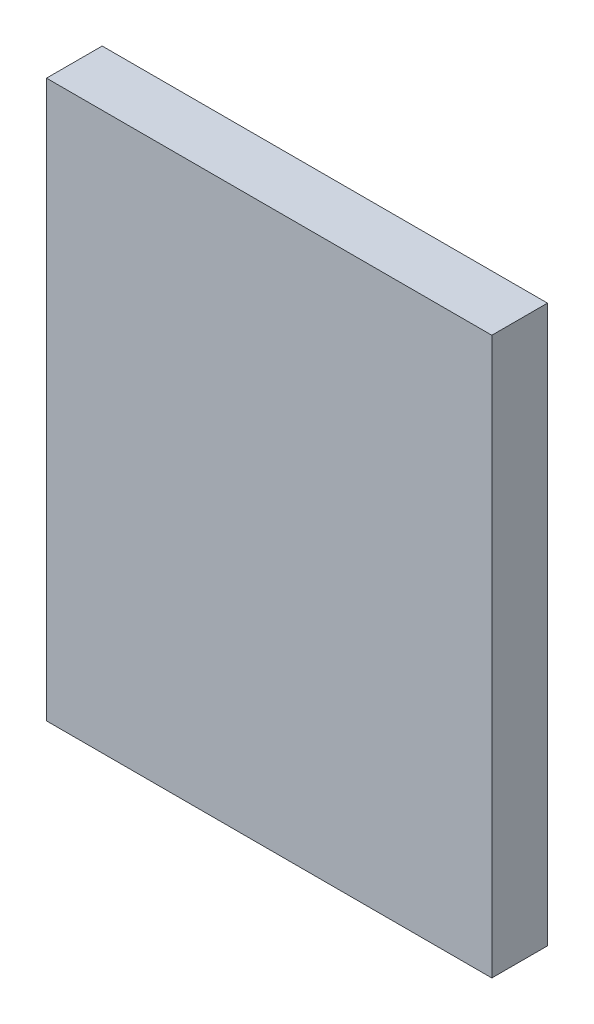
ISO-10303-21;
HEADER;
FILE_DESCRIPTION(('STEP AP214'),'2;1');
FILE_NAME('part.step','',(''),(''),'','','');
FILE_SCHEMA(('AUTOMOTIVE_DESIGN { 1 0 10303 214 1 1 1 1 }'));
ENDSEC;
DATA;
#1=APPLICATION_CONTEXT('core data for automotive mechanical design processes');
#2=APPLICATION_PROTOCOL_DEFINITION('international standard','automotive_design',2000,#1);
#3=PRODUCT_CONTEXT('',#1,'mechanical');
#4=PRODUCT('Part','Part','',(#3));
#5=PRODUCT_RELATED_PRODUCT_CATEGORY('part','',(#4));
#6=PRODUCT_DEFINITION_FORMATION('','',#4);
#7=PRODUCT_DEFINITION_CONTEXT('part definition',#1,'design');
#8=PRODUCT_DEFINITION('design','',#6,#7);
#9=PRODUCT_DEFINITION_SHAPE('','',#8);
#10=(LENGTH_UNIT() NAMED_UNIT(*) SI_UNIT(.MILLI.,.METRE.));
#11=(NAMED_UNIT(*) PLANE_ANGLE_UNIT() SI_UNIT($,.RADIAN.));
#12=(NAMED_UNIT(*) SI_UNIT($,.STERADIAN.) SOLID_ANGLE_UNIT());
#13=UNCERTAINTY_MEASURE_WITH_UNIT(LENGTH_MEASURE(1.E-05),#10,'distance_accuracy_value','');
#14=(GEOMETRIC_REPRESENTATION_CONTEXT(3) GLOBAL_UNCERTAINTY_ASSIGNED_CONTEXT((#13)) GLOBAL_UNIT_ASSIGNED_CONTEXT((#10,
#11,#12)) REPRESENTATION_CONTEXT('',''));
#15=CARTESIAN_POINT('',(0.,0.,0.));
#16=DIRECTION('',(0.,0.,1.));
#17=DIRECTION('',(1.,0.,0.));
#18=AXIS2_PLACEMENT_3D('',#15,#16,#17);
#19=CARTESIAN_POINT('',(101.6,254.,12.7));
#20=DIRECTION('',(-1.,0.,0.));
#21=DIRECTION('',(0.,0.,1.));
#22=AXIS2_PLACEMENT_3D('',#19,#20,#21);
#23=PLANE('',#22);
#24=DIRECTION('',(0.,0.,-1.));
#25=VECTOR('',#24,1.);
#26=CARTESIAN_POINT('',(101.6,0.,12.7));
#27=LINE('',#26,#25);
#28=CARTESIAN_POINT('',(101.6,0.,12.7));
#29=VERTEX_POINT('',#28);
#30=CARTESIAN_POINT('',(101.6,0.,-12.7));
#31=VERTEX_POINT('',#30);
#32=EDGE_CURVE('E107',#29,#31,#27,.T.);
#33=ORIENTED_EDGE('',*,*,#32,.T.);
#34=DIRECTION('',(0.,-1.,0.));
#35=VECTOR('',#34,1.);
#36=CARTESIAN_POINT('',(101.6,254.,-12.7));
#37=LINE('',#36,#35);
#38=CARTESIAN_POINT('',(101.6,254.,-12.7));
#39=VERTEX_POINT('',#38);
#40=EDGE_CURVE('E11',#39,#31,#37,.T.);
#41=ORIENTED_EDGE('',*,*,#40,.F.);
#42=DIRECTION('',(0.,0.,-1.));
#43=VECTOR('',#42,1.);
#44=CARTESIAN_POINT('',(101.6,254.,12.7));
#45=LINE('',#44,#43);
#46=CARTESIAN_POINT('',(101.6,254.,12.7));
#47=VERTEX_POINT('',#46);
#48=EDGE_CURVE('E89',#47,#39,#45,.T.);
#49=ORIENTED_EDGE('',*,*,#48,.F.);
#50=DIRECTION('',(0.,-1.,0.));
#51=VECTOR('',#50,1.);
#52=CARTESIAN_POINT('',(101.6,254.,12.7));
#53=LINE('',#52,#51);
#54=EDGE_CURVE('E56',#47,#29,#53,.T.);
#55=ORIENTED_EDGE('',*,*,#54,.T.);
#56=EDGE_LOOP('',(#33,#41,#49,#55));
#57=FACE_BOUND('',#56,.T.);
#58=ADVANCED_FACE('F39',(#57),#23,.F.);
#59=CARTESIAN_POINT('',(101.6,254.,-12.7));
#60=DIRECTION('',(0.,0.,1.));
#61=DIRECTION('',(1.,0.,0.));
#62=AXIS2_PLACEMENT_3D('',#59,#60,#61);
#63=PLANE('',#62);
#64=DIRECTION('',(-1.,0.,0.));
#65=VECTOR('',#64,1.);
#66=CARTESIAN_POINT('',(101.6,0.,-12.7));
#67=LINE('',#66,#65);
#68=CARTESIAN_POINT('',(-101.6,0.,-12.7));
#69=VERTEX_POINT('',#68);
#70=EDGE_CURVE('E95',#31,#69,#67,.T.);
#71=ORIENTED_EDGE('',*,*,#70,.T.);
#72=DIRECTION('',(0.,-1.,0.));
#73=VECTOR('',#72,1.);
#74=CARTESIAN_POINT('',(-101.6,254.,-12.7));
#75=LINE('',#74,#73);
#76=CARTESIAN_POINT('',(-101.6,254.,-12.7));
#77=VERTEX_POINT('',#76);
#78=EDGE_CURVE('E48',#77,#69,#75,.T.);
#79=ORIENTED_EDGE('',*,*,#78,.F.);
#80=DIRECTION('',(-1.,0.,0.));
#81=VECTOR('',#80,1.);
#82=CARTESIAN_POINT('',(101.6,254.,-12.7));
#83=LINE('',#82,#81);
#84=EDGE_CURVE('E81',#39,#77,#83,.T.);
#85=ORIENTED_EDGE('',*,*,#84,.F.);
#86=ORIENTED_EDGE('',*,*,#40,.T.);
#87=EDGE_LOOP('',(#71,#79,#85,#86));
#88=FACE_BOUND('',#87,.T.);
#89=ADVANCED_FACE('F94',(#88),#63,.F.);
#90=CARTESIAN_POINT('',(-101.6,254.,12.7));
#91=DIRECTION('',(-1.,0.,0.));
#92=DIRECTION('',(0.,0.,1.));
#93=AXIS2_PLACEMENT_3D('',#90,#91,#92);
#94=PLANE('',#93);
#95=DIRECTION('',(0.,0.,-1.));
#96=VECTOR('',#95,1.);
#97=CARTESIAN_POINT('',(-101.6,0.,12.7));
#98=LINE('',#97,#96);
#99=CARTESIAN_POINT('',(-101.6,0.,12.7));
#100=VERTEX_POINT('',#99);
#101=EDGE_CURVE('E112',#100,#69,#98,.T.);
#102=ORIENTED_EDGE('',*,*,#101,.F.);
#103=DIRECTION('',(0.,-1.,0.));
#104=VECTOR('',#103,1.);
#105=CARTESIAN_POINT('',(-101.6,254.,12.7));
#106=LINE('',#105,#104);
#107=CARTESIAN_POINT('',(-101.6,254.,12.7));
#108=VERTEX_POINT('',#107);
#109=EDGE_CURVE('E70',#108,#100,#106,.T.);
#110=ORIENTED_EDGE('',*,*,#109,.F.);
#111=DIRECTION('',(0.,0.,-1.));
#112=VECTOR('',#111,1.);
#113=CARTESIAN_POINT('',(-101.6,254.,12.7));
#114=LINE('',#113,#112);
#115=EDGE_CURVE('E88',#108,#77,#114,.T.);
#116=ORIENTED_EDGE('',*,*,#115,.T.);
#117=ORIENTED_EDGE('',*,*,#78,.T.);
#118=EDGE_LOOP('',(#102,#110,#116,#117));
#119=FACE_BOUND('',#118,.T.);
#120=ADVANCED_FACE('F99',(#119),#94,.T.);
#121=CARTESIAN_POINT('',(101.6,254.,12.7));
#122=DIRECTION('',(0.,0.,1.));
#123=DIRECTION('',(1.,0.,0.));
#124=AXIS2_PLACEMENT_3D('',#121,#122,#123);
#125=PLANE('',#124);
#126=DIRECTION('',(-1.,0.,0.));
#127=VECTOR('',#126,1.);
#128=CARTESIAN_POINT('',(101.6,0.,12.7));
#129=LINE('',#128,#127);
#130=EDGE_CURVE('E115',#29,#100,#129,.T.);
#131=ORIENTED_EDGE('',*,*,#130,.F.);
#132=ORIENTED_EDGE('',*,*,#54,.F.);
#133=DIRECTION('',(-1.,0.,0.));
#134=VECTOR('',#133,1.);
#135=CARTESIAN_POINT('',(101.6,254.,12.7));
#136=LINE('',#135,#134);
#137=EDGE_CURVE('E101',#47,#108,#136,.T.);
#138=ORIENTED_EDGE('',*,*,#137,.T.);
#139=ORIENTED_EDGE('',*,*,#109,.T.);
#140=EDGE_LOOP('',(#131,#132,#138,#139));
#141=FACE_BOUND('',#140,.T.);
#142=ADVANCED_FACE('F125',(#141),#125,.T.);
#143=CARTESIAN_POINT('',(0.,254.,0.));
#144=DIRECTION('',(0.,1.,0.));
#145=DIRECTION('',(0.,0.,1.));
#146=AXIS2_PLACEMENT_3D('',#143,#144,#145);
#147=PLANE('',#146);
#148=ORIENTED_EDGE('',*,*,#48,.T.);
#149=ORIENTED_EDGE('',*,*,#84,.T.);
#150=ORIENTED_EDGE('',*,*,#115,.F.);
#151=ORIENTED_EDGE('',*,*,#137,.F.);
#152=EDGE_LOOP('',(#148,#149,#150,#151));
#153=FACE_BOUND('',#152,.T.);
#154=ADVANCED_FACE('F85',(#153),#147,.T.);
#155=CARTESIAN_POINT('',(0.,0.,0.));
#156=DIRECTION('',(0.,1.,0.));
#157=DIRECTION('',(0.,0.,1.));
#158=AXIS2_PLACEMENT_3D('',#155,#156,#157);
#159=PLANE('',#158);
#160=ORIENTED_EDGE('',*,*,#32,.F.);
#161=ORIENTED_EDGE('',*,*,#130,.T.);
#162=ORIENTED_EDGE('',*,*,#101,.T.);
#163=ORIENTED_EDGE('',*,*,#70,.F.);
#164=EDGE_LOOP('',(#160,#161,#162,#163));
#165=FACE_BOUND('',#164,.T.);
#166=ADVANCED_FACE('F124',(#165),#159,.F.);
#167=CLOSED_SHELL('',(#58,#89,#120,#142,#154,#166));
#168=MANIFOLD_SOLID_BREP('B2',#167);
#169=ADVANCED_BREP_SHAPE_REPRESENTATION('',(#18,#168),#14);
#170=SHAPE_DEFINITION_REPRESENTATION(#9,#169);
ENDSEC;
END-ISO-10303-21;
